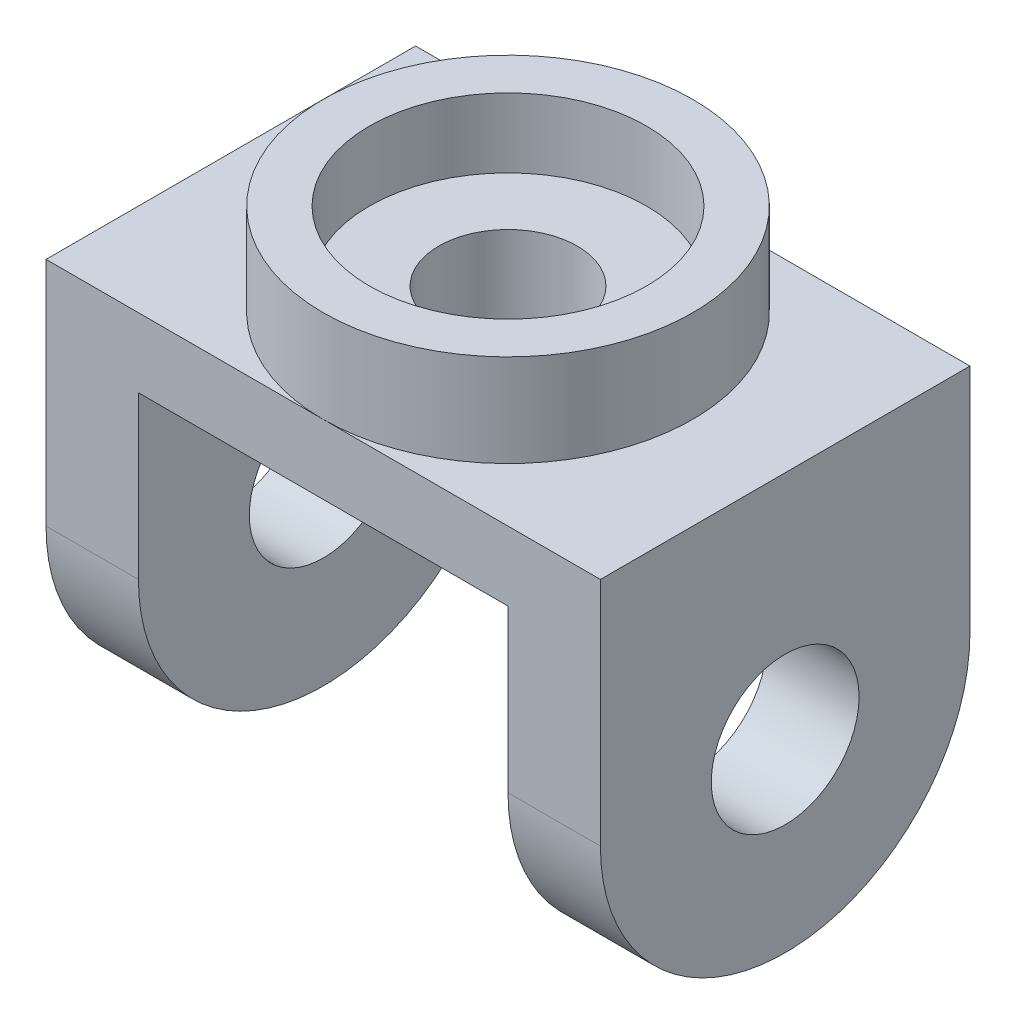
ISO-10303-21;
HEADER;
FILE_DESCRIPTION(('STEP AP214'),'2;1');
FILE_NAME('part.step','',(''),(''),'','','');
FILE_SCHEMA(('AUTOMOTIVE_DESIGN { 1 0 10303 214 1 1 1 1 }'));
ENDSEC;
DATA;
#1=APPLICATION_CONTEXT('core data for automotive mechanical design processes');
#2=APPLICATION_PROTOCOL_DEFINITION('international standard','automotive_design',2000,#1);
#3=PRODUCT_CONTEXT('',#1,'mechanical');
#4=PRODUCT('Part','Part','',(#3));
#5=PRODUCT_RELATED_PRODUCT_CATEGORY('part','',(#4));
#6=PRODUCT_DEFINITION_FORMATION('','',#4);
#7=PRODUCT_DEFINITION_CONTEXT('part definition',#1,'design');
#8=PRODUCT_DEFINITION('design','',#6,#7);
#9=PRODUCT_DEFINITION_SHAPE('','',#8);
#10=(LENGTH_UNIT() NAMED_UNIT(*) SI_UNIT(.MILLI.,.METRE.));
#11=(NAMED_UNIT(*) PLANE_ANGLE_UNIT() SI_UNIT($,.RADIAN.));
#12=(NAMED_UNIT(*) SI_UNIT($,.STERADIAN.) SOLID_ANGLE_UNIT());
#13=UNCERTAINTY_MEASURE_WITH_UNIT(LENGTH_MEASURE(1.E-05),#10,'distance_accuracy_value','');
#14=(GEOMETRIC_REPRESENTATION_CONTEXT(3) GLOBAL_UNCERTAINTY_ASSIGNED_CONTEXT((#13)) GLOBAL_UNIT_ASSIGNED_CONTEXT((#10,
#11,#12)) REPRESENTATION_CONTEXT('',''));
#15=CARTESIAN_POINT('',(0.,0.,0.));
#16=DIRECTION('',(0.,0.,1.));
#17=DIRECTION('',(1.,0.,0.));
#18=AXIS2_PLACEMENT_3D('',#15,#16,#17);
#19=CARTESIAN_POINT('',(0.,-15.,0.));
#20=DIRECTION('',(0.,1.,0.));
#21=DIRECTION('',(0.,0.,1.));
#22=AXIS2_PLACEMENT_3D('',#19,#20,#21);
#23=PLANE('',#22);
#24=CARTESIAN_POINT('',(0.,-15.,0.));
#25=DIRECTION('',(0.,1.,0.));
#26=DIRECTION('',(0.,0.,1.));
#27=AXIS2_PLACEMENT_3D('',#24,#25,#26);
#28=CIRCLE('',#27,15.);
#29=CARTESIAN_POINT('',(0.,-15.,15.));
#30=VERTEX_POINT('',#29);
#31=EDGE_CURVE('E158',#30,#30,#28,.T.);
#32=ORIENTED_EDGE('',*,*,#31,.T.);
#33=EDGE_LOOP('',(#32));
#34=FACE_BOUND('',#33,.T.);
#35=DIRECTION('',(0.,0.,1.));
#36=VECTOR('',#35,1.);
#37=CARTESIAN_POINT('',(-40.,-15.,0.));
#38=LINE('',#37,#36);
#39=CARTESIAN_POINT('',(-40.,-15.,-40.));
#40=VERTEX_POINT('',#39);
#41=CARTESIAN_POINT('',(-40.,-15.,40.));
#42=VERTEX_POINT('',#41);
#43=EDGE_CURVE('E111',#40,#42,#38,.T.);
#44=ORIENTED_EDGE('',*,*,#43,.F.);
#45=DIRECTION('',(-1.,0.,0.));
#46=VECTOR('',#45,1.);
#47=CARTESIAN_POINT('',(60.,-15.,-40.));
#48=LINE('',#47,#46);
#49=CARTESIAN_POINT('',(40.,-15.,-40.));
#50=VERTEX_POINT('',#49);
#51=EDGE_CURVE('E173',#50,#40,#48,.T.);
#52=ORIENTED_EDGE('',*,*,#51,.F.);
#53=DIRECTION('',(0.,0.,-1.));
#54=VECTOR('',#53,1.);
#55=CARTESIAN_POINT('',(40.,-15.,0.));
#56=LINE('',#55,#54);
#57=CARTESIAN_POINT('',(40.,-15.,40.));
#58=VERTEX_POINT('',#57);
#59=EDGE_CURVE('E142',#58,#50,#56,.T.);
#60=ORIENTED_EDGE('',*,*,#59,.F.);
#61=DIRECTION('',(1.,0.,0.));
#62=VECTOR('',#61,1.);
#63=CARTESIAN_POINT('',(60.,-15.,40.));
#64=LINE('',#63,#62);
#65=EDGE_CURVE('E56',#42,#58,#64,.T.);
#66=ORIENTED_EDGE('',*,*,#65,.F.);
#67=EDGE_LOOP('',(#44,#52,#60,#66));
#68=FACE_BOUND('',#67,.T.);
#69=ADVANCED_FACE('F33',(#34,#68),#23,.F.);
#70=CARTESIAN_POINT('',(0.,0.,0.));
#71=DIRECTION('',(0.,1.,0.));
#72=DIRECTION('',(0.,0.,1.));
#73=AXIS2_PLACEMENT_3D('',#70,#71,#72);
#74=PLANE('',#73);
#75=CARTESIAN_POINT('',(0.,0.,0.));
#76=DIRECTION('',(0.,1.,0.));
#77=DIRECTION('',(0.,0.,1.));
#78=AXIS2_PLACEMENT_3D('',#75,#76,#77);
#79=CIRCLE('',#78,40.);
#80=CARTESIAN_POINT('',(0.,0.,40.));
#81=VERTEX_POINT('',#80);
#82=CARTESIAN_POINT('',(0.,0.,-40.));
#83=VERTEX_POINT('',#82);
#84=EDGE_CURVE('E44',#81,#83,#79,.T.);
#85=ORIENTED_EDGE('',*,*,#84,.F.);
#86=DIRECTION('',(1.,0.,0.));
#87=VECTOR('',#86,1.);
#88=CARTESIAN_POINT('',(60.,0.,40.));
#89=LINE('',#88,#87);
#90=CARTESIAN_POINT('',(60.,0.,40.));
#91=VERTEX_POINT('',#90);
#92=EDGE_CURVE('E179',#81,#91,#89,.T.);
#93=ORIENTED_EDGE('',*,*,#92,.T.);
#94=DIRECTION('',(0.,0.,-1.));
#95=VECTOR('',#94,1.);
#96=CARTESIAN_POINT('',(60.,0.,40.));
#97=LINE('',#96,#95);
#98=CARTESIAN_POINT('',(60.,0.,-40.));
#99=VERTEX_POINT('',#98);
#100=EDGE_CURVE('E182',#91,#99,#97,.T.);
#101=ORIENTED_EDGE('',*,*,#100,.T.);
#102=DIRECTION('',(-1.,0.,0.));
#103=VECTOR('',#102,1.);
#104=CARTESIAN_POINT('',(60.,0.,-40.));
#105=LINE('',#104,#103);
#106=EDGE_CURVE('E174',#99,#83,#105,.T.);
#107=ORIENTED_EDGE('',*,*,#106,.T.);
#108=EDGE_LOOP('',(#85,#93,#101,#107));
#109=FACE_BOUND('',#108,.T.);
#110=ADVANCED_FACE('F218',(#109),#74,.T.);
#111=CARTESIAN_POINT('',(-60.,-15.,40.));
#112=DIRECTION('',(-1.,0.,0.));
#113=DIRECTION('',(0.,0.,1.));
#114=AXIS2_PLACEMENT_3D('',#111,#112,#113);
#115=PLANE('',#114);
#116=CARTESIAN_POINT('',(-60.,-50.,0.));
#117=DIRECTION('',(-1.,0.,0.));
#118=DIRECTION('',(0.,0.,1.));
#119=AXIS2_PLACEMENT_3D('',#116,#117,#118);
#120=CIRCLE('',#119,16.);
#121=CARTESIAN_POINT('',(-60.,-50.,16.));
#122=VERTEX_POINT('',#121);
#123=EDGE_CURVE('E388',#122,#122,#120,.T.);
#124=ORIENTED_EDGE('',*,*,#123,.F.);
#125=EDGE_LOOP('',(#124));
#126=FACE_BOUND('',#125,.T.);
#127=DIRECTION('',(0.,0.,1.));
#128=VECTOR('',#127,1.);
#129=CARTESIAN_POINT('',(-60.,0.,40.));
#130=LINE('',#129,#128);
#131=CARTESIAN_POINT('',(-60.,0.,-40.));
#132=VERTEX_POINT('',#131);
#133=CARTESIAN_POINT('',(-60.,0.,40.));
#134=VERTEX_POINT('',#133);
#135=EDGE_CURVE('E169',#132,#134,#130,.T.);
#136=ORIENTED_EDGE('',*,*,#135,.F.);
#137=DIRECTION('',(0.,1.,0.));
#138=VECTOR('',#137,1.);
#139=CARTESIAN_POINT('',(-60.,-15.,-40.));
#140=LINE('',#139,#138);
#141=CARTESIAN_POINT('',(-60.,-50.,-40.));
#142=VERTEX_POINT('',#141);
#143=EDGE_CURVE('E42',#142,#132,#140,.T.);
#144=ORIENTED_EDGE('',*,*,#143,.F.);
#145=CARTESIAN_POINT('',(-60.,-50.,0.));
#146=DIRECTION('',(-1.,0.,0.));
#147=DIRECTION('',(0.,0.,1.));
#148=AXIS2_PLACEMENT_3D('',#145,#146,#147);
#149=CIRCLE('',#148,40.);
#150=CARTESIAN_POINT('',(-60.,-50.,40.));
#151=VERTEX_POINT('',#150);
#152=EDGE_CURVE('E126',#142,#151,#149,.T.);
#153=ORIENTED_EDGE('',*,*,#152,.T.);
#154=DIRECTION('',(0.,1.,0.));
#155=VECTOR('',#154,1.);
#156=CARTESIAN_POINT('',(-60.,-15.,40.));
#157=LINE('',#156,#155);
#158=EDGE_CURVE('E117',#151,#134,#157,.T.);
#159=ORIENTED_EDGE('',*,*,#158,.T.);
#160=EDGE_LOOP('',(#136,#144,#153,#159));
#161=FACE_BOUND('',#160,.T.);
#162=ADVANCED_FACE('F35',(#126,#161),#115,.T.);
#163=CARTESIAN_POINT('',(60.,-15.,-40.));
#164=DIRECTION('',(0.,0.,-1.));
#165=DIRECTION('',(-1.,0.,0.));
#166=AXIS2_PLACEMENT_3D('',#163,#164,#165);
#167=PLANE('',#166);
#168=ORIENTED_EDGE('',*,*,#106,.F.);
#169=DIRECTION('',(0.,1.,0.));
#170=VECTOR('',#169,1.);
#171=CARTESIAN_POINT('',(60.,-15.,-40.));
#172=LINE('',#171,#170);
#173=CARTESIAN_POINT('',(60.,-50.,-40.));
#174=VERTEX_POINT('',#173);
#175=EDGE_CURVE('E190',#174,#99,#172,.T.);
#176=ORIENTED_EDGE('',*,*,#175,.F.);
#177=DIRECTION('',(1.,0.,0.));
#178=VECTOR('',#177,1.);
#179=CARTESIAN_POINT('',(40.,-50.,-40.));
#180=LINE('',#179,#178);
#181=CARTESIAN_POINT('',(40.,-50.,-40.));
#182=VERTEX_POINT('',#181);
#183=EDGE_CURVE('E147',#182,#174,#180,.T.);
#184=ORIENTED_EDGE('',*,*,#183,.F.);
#185=DIRECTION('',(0.,-1.,0.));
#186=VECTOR('',#185,1.);
#187=CARTESIAN_POINT('',(40.,0.,-40.));
#188=LINE('',#187,#186);
#189=EDGE_CURVE('E140',#50,#182,#188,.T.);
#190=ORIENTED_EDGE('',*,*,#189,.F.);
#191=ORIENTED_EDGE('',*,*,#51,.T.);
#192=DIRECTION('',(0.,-1.,0.));
#193=VECTOR('',#192,1.);
#194=CARTESIAN_POINT('',(-40.,0.,-40.));
#195=LINE('',#194,#193);
#196=CARTESIAN_POINT('',(-40.,-50.,-40.));
#197=VERTEX_POINT('',#196);
#198=EDGE_CURVE('E122',#40,#197,#195,.T.);
#199=ORIENTED_EDGE('',*,*,#198,.T.);
#200=DIRECTION('',(-1.,0.,0.));
#201=VECTOR('',#200,1.);
#202=CARTESIAN_POINT('',(-40.,-50.,-40.));
#203=LINE('',#202,#201);
#204=EDGE_CURVE('E121',#197,#142,#203,.T.);
#205=ORIENTED_EDGE('',*,*,#204,.T.);
#206=ORIENTED_EDGE('',*,*,#143,.T.);
#207=EDGE_CURVE('E185',#83,#132,#105,.T.);
#208=ORIENTED_EDGE('',*,*,#207,.F.);
#209=EDGE_LOOP('',(#168,#176,#184,#190,#191,#199,#205,#206,#208));
#210=FACE_BOUND('',#209,.T.);
#211=ADVANCED_FACE('F203',(#210),#167,.T.);
#212=CARTESIAN_POINT('',(60.,-15.,40.));
#213=DIRECTION('',(1.,0.,0.));
#214=DIRECTION('',(0.,0.,-1.));
#215=AXIS2_PLACEMENT_3D('',#212,#213,#214);
#216=PLANE('',#215);
#217=CARTESIAN_POINT('',(60.,-50.,0.));
#218=DIRECTION('',(1.,0.,0.));
#219=DIRECTION('',(0.,0.,-1.));
#220=AXIS2_PLACEMENT_3D('',#217,#218,#219);
#221=CIRCLE('',#220,16.);
#222=CARTESIAN_POINT('',(60.,-50.,-16.));
#223=VERTEX_POINT('',#222);
#224=EDGE_CURVE('E128',#223,#223,#221,.T.);
#225=ORIENTED_EDGE('',*,*,#224,.F.);
#226=EDGE_LOOP('',(#225));
#227=FACE_BOUND('',#226,.T.);
#228=ORIENTED_EDGE('',*,*,#100,.F.);
#229=DIRECTION('',(0.,1.,0.));
#230=VECTOR('',#229,1.);
#231=CARTESIAN_POINT('',(60.,-15.,40.));
#232=LINE('',#231,#230);
#233=CARTESIAN_POINT('',(60.,-50.,40.));
#234=VERTEX_POINT('',#233);
#235=EDGE_CURVE('E192',#234,#91,#232,.T.);
#236=ORIENTED_EDGE('',*,*,#235,.F.);
#237=CARTESIAN_POINT('',(60.,-50.,0.));
#238=DIRECTION('',(1.,0.,0.));
#239=DIRECTION('',(0.,0.,-1.));
#240=AXIS2_PLACEMENT_3D('',#237,#238,#239);
#241=CIRCLE('',#240,40.);
#242=EDGE_CURVE('E135',#234,#174,#241,.T.);
#243=ORIENTED_EDGE('',*,*,#242,.T.);
#244=ORIENTED_EDGE('',*,*,#175,.T.);
#245=EDGE_LOOP('',(#228,#236,#243,#244));
#246=FACE_BOUND('',#245,.T.);
#247=ADVANCED_FACE('F216',(#227,#246),#216,.T.);
#248=CARTESIAN_POINT('',(60.,-15.,40.));
#249=DIRECTION('',(0.,0.,1.));
#250=DIRECTION('',(1.,0.,0.));
#251=AXIS2_PLACEMENT_3D('',#248,#249,#250);
#252=PLANE('',#251);
#253=EDGE_CURVE('E180',#134,#81,#89,.T.);
#254=ORIENTED_EDGE('',*,*,#253,.F.);
#255=ORIENTED_EDGE('',*,*,#158,.F.);
#256=DIRECTION('',(-1.,0.,0.));
#257=VECTOR('',#256,1.);
#258=CARTESIAN_POINT('',(-40.,-50.,40.));
#259=LINE('',#258,#257);
#260=CARTESIAN_POINT('',(-40.,-50.,40.));
#261=VERTEX_POINT('',#260);
#262=EDGE_CURVE('E114',#261,#151,#259,.T.);
#263=ORIENTED_EDGE('',*,*,#262,.F.);
#264=DIRECTION('',(0.,-1.,0.));
#265=VECTOR('',#264,1.);
#266=CARTESIAN_POINT('',(-40.,0.,40.));
#267=LINE('',#266,#265);
#268=EDGE_CURVE('E51',#42,#261,#267,.T.);
#269=ORIENTED_EDGE('',*,*,#268,.F.);
#270=ORIENTED_EDGE('',*,*,#65,.T.);
#271=DIRECTION('',(0.,-1.,0.));
#272=VECTOR('',#271,1.);
#273=CARTESIAN_POINT('',(40.,0.,40.));
#274=LINE('',#273,#272);
#275=CARTESIAN_POINT('',(40.,-50.,40.));
#276=VERTEX_POINT('',#275);
#277=EDGE_CURVE('E145',#58,#276,#274,.T.);
#278=ORIENTED_EDGE('',*,*,#277,.T.);
#279=DIRECTION('',(1.,0.,0.));
#280=VECTOR('',#279,1.);
#281=CARTESIAN_POINT('',(40.,-50.,40.));
#282=LINE('',#281,#280);
#283=EDGE_CURVE('E150',#276,#234,#282,.T.);
#284=ORIENTED_EDGE('',*,*,#283,.T.);
#285=ORIENTED_EDGE('',*,*,#235,.T.);
#286=ORIENTED_EDGE('',*,*,#92,.F.);
#287=EDGE_LOOP('',(#254,#255,#263,#269,#270,#278,#284,#285,#286));
#288=FACE_BOUND('',#287,.T.);
#289=ADVANCED_FACE('F116',(#288),#252,.T.);
#290=EDGE_CURVE('E11',#83,#81,#79,.T.);
#291=ORIENTED_EDGE('',*,*,#290,.F.);
#292=ORIENTED_EDGE('',*,*,#207,.T.);
#293=ORIENTED_EDGE('',*,*,#135,.T.);
#294=ORIENTED_EDGE('',*,*,#253,.T.);
#295=EDGE_LOOP('',(#291,#292,#293,#294));
#296=FACE_BOUND('',#295,.T.);
#297=ADVANCED_FACE('F199',(#296),#74,.T.);
#298=CARTESIAN_POINT('',(0.,20.,0.));
#299=DIRECTION('',(0.,-1.,0.));
#300=DIRECTION('',(0.,0.,-1.));
#301=AXIS2_PLACEMENT_3D('',#298,#299,#300);
#302=CYLINDRICAL_SURFACE('',#301,40.);
#303=CARTESIAN_POINT('',(0.,20.,0.));
#304=DIRECTION('',(0.,1.,0.));
#305=DIRECTION('',(0.,0.,1.));
#306=AXIS2_PLACEMENT_3D('',#303,#304,#305);
#307=CIRCLE('',#306,40.);
#308=CARTESIAN_POINT('',(0.,20.,40.));
#309=VERTEX_POINT('',#308);
#310=EDGE_CURVE('E167',#309,#309,#307,.T.);
#311=ORIENTED_EDGE('',*,*,#310,.F.);
#312=EDGE_LOOP('',(#311));
#313=FACE_BOUND('',#312,.T.);
#314=ORIENTED_EDGE('',*,*,#84,.T.);
#315=ORIENTED_EDGE('',*,*,#290,.T.);
#316=EDGE_LOOP('',(#314,#315));
#317=FACE_BOUND('',#316,.T.);
#318=ADVANCED_FACE('F220',(#313,#317),#302,.T.);
#319=CARTESIAN_POINT('',(0.,20.,0.));
#320=DIRECTION('',(0.,1.,0.));
#321=DIRECTION('',(0.,0.,1.));
#322=AXIS2_PLACEMENT_3D('',#319,#320,#321);
#323=PLANE('',#322);
#324=CARTESIAN_POINT('',(0.,20.,0.));
#325=DIRECTION('',(0.,1.,0.));
#326=DIRECTION('',(0.,0.,1.));
#327=AXIS2_PLACEMENT_3D('',#324,#325,#326);
#328=CIRCLE('',#327,30.);
#329=CARTESIAN_POINT('',(0.,20.,30.));
#330=VERTEX_POINT('',#329);
#331=EDGE_CURVE('E161',#330,#330,#328,.T.);
#332=ORIENTED_EDGE('',*,*,#331,.F.);
#333=EDGE_LOOP('',(#332));
#334=FACE_BOUND('',#333,.T.);
#335=ORIENTED_EDGE('',*,*,#310,.T.);
#336=EDGE_LOOP('',(#335));
#337=FACE_BOUND('',#336,.T.);
#338=ADVANCED_FACE('F222',(#334,#337),#323,.T.);
#339=CARTESIAN_POINT('',(0.,5.,0.));
#340=DIRECTION('',(0.,1.,0.));
#341=DIRECTION('',(0.,0.,1.));
#342=AXIS2_PLACEMENT_3D('',#339,#340,#341);
#343=CYLINDRICAL_SURFACE('',#342,30.);
#344=CARTESIAN_POINT('',(0.,5.,0.));
#345=DIRECTION('',(0.,1.,0.));
#346=DIRECTION('',(0.,0.,1.));
#347=AXIS2_PLACEMENT_3D('',#344,#345,#346);
#348=CIRCLE('',#347,30.);
#349=CARTESIAN_POINT('',(0.,5.,30.));
#350=VERTEX_POINT('',#349);
#351=EDGE_CURVE('E162',#350,#350,#348,.T.);
#352=ORIENTED_EDGE('',*,*,#351,.F.);
#353=EDGE_LOOP('',(#352));
#354=FACE_BOUND('',#353,.T.);
#355=ORIENTED_EDGE('',*,*,#331,.T.);
#356=EDGE_LOOP('',(#355));
#357=FACE_BOUND('',#356,.T.);
#358=ADVANCED_FACE('F229',(#354,#357),#343,.F.);
#359=CARTESIAN_POINT('',(0.,5.,0.));
#360=DIRECTION('',(0.,1.,0.));
#361=DIRECTION('',(0.,0.,1.));
#362=AXIS2_PLACEMENT_3D('',#359,#360,#361);
#363=PLANE('',#362);
#364=CARTESIAN_POINT('',(0.,5.,0.));
#365=DIRECTION('',(0.,1.,0.));
#366=DIRECTION('',(0.,0.,1.));
#367=AXIS2_PLACEMENT_3D('',#364,#365,#366);
#368=CIRCLE('',#367,15.);
#369=CARTESIAN_POINT('',(0.,5.,15.));
#370=VERTEX_POINT('',#369);
#371=EDGE_CURVE('E153',#370,#370,#368,.T.);
#372=ORIENTED_EDGE('',*,*,#371,.F.);
#373=EDGE_LOOP('',(#372));
#374=FACE_BOUND('',#373,.T.);
#375=ORIENTED_EDGE('',*,*,#351,.T.);
#376=EDGE_LOOP('',(#375));
#377=FACE_BOUND('',#376,.T.);
#378=ADVANCED_FACE('F279',(#374,#377),#363,.T.);
#379=CARTESIAN_POINT('',(0.,-37.,0.));
#380=DIRECTION('',(0.,1.,0.));
#381=DIRECTION('',(0.,0.,1.));
#382=AXIS2_PLACEMENT_3D('',#379,#380,#381);
#383=CYLINDRICAL_SURFACE('',#382,15.);
#384=ORIENTED_EDGE('',*,*,#371,.T.);
#385=EDGE_LOOP('',(#384));
#386=FACE_BOUND('',#385,.T.);
#387=ORIENTED_EDGE('',*,*,#31,.F.);
#388=EDGE_LOOP('',(#387));
#389=FACE_BOUND('',#388,.T.);
#390=ADVANCED_FACE('F289',(#386,#389),#383,.F.);
#391=CARTESIAN_POINT('',(40.,-50.,0.));
#392=DIRECTION('',(1.,0.,0.));
#393=DIRECTION('',(0.,0.,-1.));
#394=AXIS2_PLACEMENT_3D('',#391,#392,#393);
#395=CYLINDRICAL_SURFACE('',#394,40.);
#396=ORIENTED_EDGE('',*,*,#242,.F.);
#397=ORIENTED_EDGE('',*,*,#283,.F.);
#398=CARTESIAN_POINT('',(40.,-50.,0.));
#399=DIRECTION('',(1.,0.,0.));
#400=DIRECTION('',(0.,0.,-1.));
#401=AXIS2_PLACEMENT_3D('',#398,#399,#400);
#402=CIRCLE('',#401,40.);
#403=EDGE_CURVE('E137',#276,#182,#402,.T.);
#404=ORIENTED_EDGE('',*,*,#403,.T.);
#405=ORIENTED_EDGE('',*,*,#183,.T.);
#406=EDGE_LOOP('',(#396,#397,#404,#405));
#407=FACE_BOUND('',#406,.T.);
#408=ADVANCED_FACE('F213',(#407),#395,.T.);
#409=CARTESIAN_POINT('',(40.,0.,0.));
#410=DIRECTION('',(1.,0.,0.));
#411=DIRECTION('',(0.,0.,-1.));
#412=AXIS2_PLACEMENT_3D('',#409,#410,#411);
#413=PLANE('',#412);
#414=CARTESIAN_POINT('',(40.,-50.,0.));
#415=DIRECTION('',(1.,0.,0.));
#416=DIRECTION('',(0.,0.,-1.));
#417=AXIS2_PLACEMENT_3D('',#414,#415,#416);
#418=CIRCLE('',#417,16.);
#419=CARTESIAN_POINT('',(40.,-50.,-16.));
#420=VERTEX_POINT('',#419);
#421=EDGE_CURVE('E386',#420,#420,#418,.T.);
#422=ORIENTED_EDGE('',*,*,#421,.T.);
#423=EDGE_LOOP('',(#422));
#424=FACE_BOUND('',#423,.T.);
#425=ORIENTED_EDGE('',*,*,#403,.F.);
#426=ORIENTED_EDGE('',*,*,#277,.F.);
#427=ORIENTED_EDGE('',*,*,#59,.T.);
#428=ORIENTED_EDGE('',*,*,#189,.T.);
#429=EDGE_LOOP('',(#425,#426,#427,#428));
#430=FACE_BOUND('',#429,.T.);
#431=ADVANCED_FACE('F209',(#424,#430),#413,.F.);
#432=CARTESIAN_POINT('',(-40.,-50.,0.));
#433=DIRECTION('',(-1.,0.,0.));
#434=DIRECTION('',(0.,0.,1.));
#435=AXIS2_PLACEMENT_3D('',#432,#433,#434);
#436=CYLINDRICAL_SURFACE('',#435,40.);
#437=ORIENTED_EDGE('',*,*,#152,.F.);
#438=ORIENTED_EDGE('',*,*,#204,.F.);
#439=CARTESIAN_POINT('',(-40.,-50.,0.));
#440=DIRECTION('',(-1.,0.,0.));
#441=DIRECTION('',(0.,0.,1.));
#442=AXIS2_PLACEMENT_3D('',#439,#440,#441);
#443=CIRCLE('',#442,40.);
#444=EDGE_CURVE('E108',#197,#261,#443,.T.);
#445=ORIENTED_EDGE('',*,*,#444,.T.);
#446=ORIENTED_EDGE('',*,*,#262,.T.);
#447=EDGE_LOOP('',(#437,#438,#445,#446));
#448=FACE_BOUND('',#447,.T.);
#449=ADVANCED_FACE('F124',(#448),#436,.T.);
#450=CARTESIAN_POINT('',(-40.,0.,0.));
#451=DIRECTION('',(-1.,0.,0.));
#452=DIRECTION('',(0.,0.,1.));
#453=AXIS2_PLACEMENT_3D('',#450,#451,#452);
#454=PLANE('',#453);
#455=CARTESIAN_POINT('',(-40.,-50.,0.));
#456=DIRECTION('',(-1.,0.,0.));
#457=DIRECTION('',(0.,0.,1.));
#458=AXIS2_PLACEMENT_3D('',#455,#456,#457);
#459=CIRCLE('',#458,16.);
#460=CARTESIAN_POINT('',(-40.,-50.,16.));
#461=VERTEX_POINT('',#460);
#462=EDGE_CURVE('E37',#461,#461,#459,.T.);
#463=ORIENTED_EDGE('',*,*,#462,.T.);
#464=EDGE_LOOP('',(#463));
#465=FACE_BOUND('',#464,.T.);
#466=ORIENTED_EDGE('',*,*,#444,.F.);
#467=ORIENTED_EDGE('',*,*,#198,.F.);
#468=ORIENTED_EDGE('',*,*,#43,.T.);
#469=ORIENTED_EDGE('',*,*,#268,.T.);
#470=EDGE_LOOP('',(#466,#467,#468,#469));
#471=FACE_BOUND('',#470,.T.);
#472=ADVANCED_FACE('F106',(#465,#471),#454,.F.);
#473=CARTESIAN_POINT('',(79.0000000000001,-50.,0.));
#474=DIRECTION('',(-1.,0.,0.));
#475=DIRECTION('',(0.,0.,1.));
#476=AXIS2_PLACEMENT_3D('',#473,#474,#475);
#477=CYLINDRICAL_SURFACE('',#476,16.);
#478=ORIENTED_EDGE('',*,*,#123,.T.);
#479=EDGE_LOOP('',(#478));
#480=FACE_BOUND('',#479,.T.);
#481=ORIENTED_EDGE('',*,*,#462,.F.);
#482=EDGE_LOOP('',(#481));
#483=FACE_BOUND('',#482,.T.);
#484=ADVANCED_FACE('F355',(#480,#483),#477,.F.);
#485=ORIENTED_EDGE('',*,*,#224,.T.);
#486=EDGE_LOOP('',(#485));
#487=FACE_BOUND('',#486,.T.);
#488=ORIENTED_EDGE('',*,*,#421,.F.);
#489=EDGE_LOOP('',(#488));
#490=FACE_BOUND('',#489,.T.);
#491=ADVANCED_FACE('F366',(#487,#490),#477,.F.);
#492=CLOSED_SHELL('',(#69,#110,#162,#211,#247,#289,#297,#318,#338,#358,#378,#390,#408,#431,#449,
#472,#484,#491));
#493=MANIFOLD_SOLID_BREP('B2',#492);
#494=ADVANCED_BREP_SHAPE_REPRESENTATION('',(#18,#493),#14);
#495=SHAPE_DEFINITION_REPRESENTATION(#9,#494);
ENDSEC;
END-ISO-10303-21;
